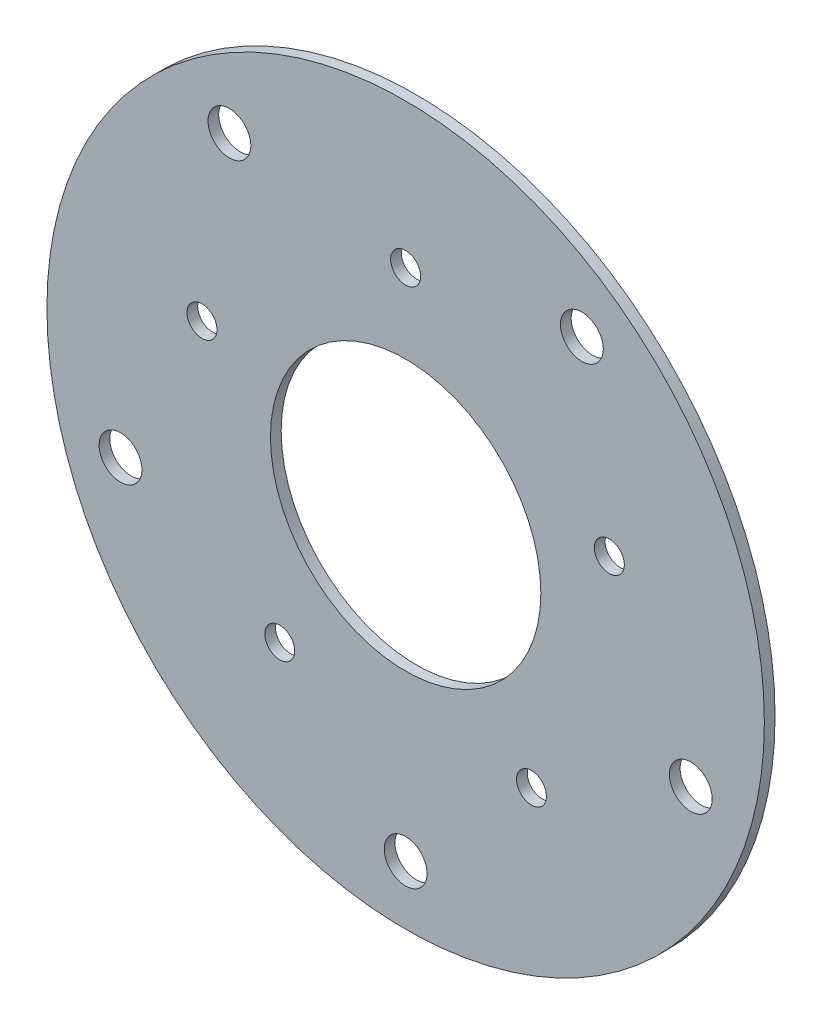
ISO-10303-21;
HEADER;
FILE_DESCRIPTION(('STEP AP214'),'2;1');
FILE_NAME('part.step','',(''),(''),'','','');
FILE_SCHEMA(('AUTOMOTIVE_DESIGN { 1 0 10303 214 1 1 1 1 }'));
ENDSEC;
DATA;
#1=APPLICATION_CONTEXT('core data for automotive mechanical design processes');
#2=APPLICATION_PROTOCOL_DEFINITION('international standard','automotive_design',2000,#1);
#3=PRODUCT_CONTEXT('',#1,'mechanical');
#4=PRODUCT('Part','Part','',(#3));
#5=PRODUCT_RELATED_PRODUCT_CATEGORY('part','',(#4));
#6=PRODUCT_DEFINITION_FORMATION('','',#4);
#7=PRODUCT_DEFINITION_CONTEXT('part definition',#1,'design');
#8=PRODUCT_DEFINITION('design','',#6,#7);
#9=PRODUCT_DEFINITION_SHAPE('','',#8);
#10=(LENGTH_UNIT() NAMED_UNIT(*) SI_UNIT(.MILLI.,.METRE.));
#11=(NAMED_UNIT(*) PLANE_ANGLE_UNIT() SI_UNIT($,.RADIAN.));
#12=(NAMED_UNIT(*) SI_UNIT($,.STERADIAN.) SOLID_ANGLE_UNIT());
#13=UNCERTAINTY_MEASURE_WITH_UNIT(LENGTH_MEASURE(1.E-05),#10,'distance_accuracy_value','');
#14=(GEOMETRIC_REPRESENTATION_CONTEXT(3) GLOBAL_UNCERTAINTY_ASSIGNED_CONTEXT((#13)) GLOBAL_UNIT_ASSIGNED_CONTEXT((#10,
#11,#12)) REPRESENTATION_CONTEXT('',''));
#15=CARTESIAN_POINT('',(0.,0.,0.));
#16=DIRECTION('',(0.,0.,1.));
#17=DIRECTION('',(1.,0.,0.));
#18=AXIS2_PLACEMENT_3D('',#15,#16,#17);
#19=CARTESIAN_POINT('',(0.,0.,1.));
#20=DIRECTION('',(0.,0.,1.));
#21=DIRECTION('',(1.,0.,0.));
#22=AXIS2_PLACEMENT_3D('',#19,#20,#21);
#23=PLANE('',#22);
#24=CARTESIAN_POINT('',(19.0211303259031,6.18033988749875,1.));
#25=DIRECTION('',(0.,0.,1.));
#26=DIRECTION('',(1.,0.,0.));
#27=AXIS2_PLACEMENT_3D('',#24,#25,#26);
#28=CIRCLE('',#27,1.4);
#29=CARTESIAN_POINT('',(20.4211303259031,6.18033988749875,1.));
#30=VERTEX_POINT('',#29);
#31=EDGE_CURVE('E96',#30,#30,#28,.T.);
#32=ORIENTED_EDGE('',*,*,#31,.F.);
#33=EDGE_LOOP('',(#32));
#34=FACE_BOUND('',#33,.T.);
#35=CARTESIAN_POINT('',(-19.021130325903,6.18033988749904,1.));
#36=DIRECTION('',(0.,0.,1.));
#37=DIRECTION('',(1.,0.,0.));
#38=AXIS2_PLACEMENT_3D('',#35,#36,#37);
#39=CIRCLE('',#38,1.4);
#40=CARTESIAN_POINT('',(-17.621130325903,6.18033988749904,1.));
#41=VERTEX_POINT('',#40);
#42=EDGE_CURVE('E84',#41,#41,#39,.T.);
#43=ORIENTED_EDGE('',*,*,#42,.F.);
#44=EDGE_LOOP('',(#43));
#45=FACE_BOUND('',#44,.T.);
#46=CARTESIAN_POINT('',(26.6295824562642,-8.65247584249883,1.));
#47=DIRECTION('',(0.,0.,1.));
#48=DIRECTION('',(1.,0.,0.));
#49=AXIS2_PLACEMENT_3D('',#46,#47,#48);
#50=CIRCLE('',#49,2.);
#51=CARTESIAN_POINT('',(28.6295824562642,-8.65247584249883,1.));
#52=VERTEX_POINT('',#51);
#53=EDGE_CURVE('E72',#52,#52,#50,.T.);
#54=ORIENTED_EDGE('',*,*,#53,.F.);
#55=EDGE_LOOP('',(#54));
#56=FACE_BOUND('',#55,.T.);
#57=CARTESIAN_POINT('',(-16.4579870641891,22.6524758424986,1.));
#58=DIRECTION('',(0.,0.,1.));
#59=DIRECTION('',(1.,0.,0.));
#60=AXIS2_PLACEMENT_3D('',#57,#58,#59);
#61=CIRCLE('',#60,2.);
#62=CARTESIAN_POINT('',(-14.4579870641891,22.6524758424986,1.));
#63=VERTEX_POINT('',#62);
#64=EDGE_CURVE('E60',#63,#63,#61,.T.);
#65=ORIENTED_EDGE('',*,*,#64,.F.);
#66=EDGE_LOOP('',(#65));
#67=FACE_BOUND('',#66,.T.);
#68=CARTESIAN_POINT('',(0.,-28.,1.));
#69=DIRECTION('',(0.,0.,1.));
#70=DIRECTION('',(1.,0.,0.));
#71=AXIS2_PLACEMENT_3D('',#68,#69,#70);
#72=CIRCLE('',#71,2.);
#73=CARTESIAN_POINT('',(2.,-28.,1.));
#74=VERTEX_POINT('',#73);
#75=EDGE_CURVE('E48',#74,#74,#72,.T.);
#76=ORIENTED_EDGE('',*,*,#75,.F.);
#77=EDGE_LOOP('',(#76));
#78=FACE_BOUND('',#77,.T.);
#79=CARTESIAN_POINT('',(0.,0.,1.));
#80=DIRECTION('',(0.,0.,1.));
#81=DIRECTION('',(1.,0.,0.));
#82=AXIS2_PLACEMENT_3D('',#79,#80,#81);
#83=CIRCLE('',#82,33.5);
#84=CARTESIAN_POINT('',(33.5,0.,1.));
#85=VERTEX_POINT('',#84);
#86=EDGE_CURVE('E10',#85,#85,#83,.T.);
#87=ORIENTED_EDGE('',*,*,#86,.T.);
#88=EDGE_LOOP('',(#87));
#89=FACE_BOUND('',#88,.T.);
#90=CARTESIAN_POINT('',(0.,0.,1.));
#91=DIRECTION('',(0.,0.,1.));
#92=DIRECTION('',(1.,0.,0.));
#93=AXIS2_PLACEMENT_3D('',#90,#91,#92);
#94=CIRCLE('',#93,12.625);
#95=CARTESIAN_POINT('',(12.625,0.,1.));
#96=VERTEX_POINT('',#95);
#97=EDGE_CURVE('E43',#96,#96,#94,.T.);
#98=ORIENTED_EDGE('',*,*,#97,.F.);
#99=EDGE_LOOP('',(#98));
#100=FACE_BOUND('',#99,.T.);
#101=CARTESIAN_POINT('',(-26.6295824562643,-8.65247584249846,1.));
#102=DIRECTION('',(0.,0.,1.));
#103=DIRECTION('',(1.,0.,0.));
#104=AXIS2_PLACEMENT_3D('',#101,#102,#103);
#105=CIRCLE('',#104,2.);
#106=CARTESIAN_POINT('',(-24.6295824562643,-8.65247584249846,1.));
#107=VERTEX_POINT('',#106);
#108=EDGE_CURVE('E54',#107,#107,#105,.T.);
#109=ORIENTED_EDGE('',*,*,#108,.F.);
#110=EDGE_LOOP('',(#109));
#111=FACE_BOUND('',#110,.T.);
#112=CARTESIAN_POINT('',(16.4579870641894,22.6524758424984,1.));
#113=DIRECTION('',(0.,0.,1.));
#114=DIRECTION('',(1.,0.,0.));
#115=AXIS2_PLACEMENT_3D('',#112,#113,#114);
#116=CIRCLE('',#115,2.);
#117=CARTESIAN_POINT('',(18.4579870641894,22.6524758424984,1.));
#118=VERTEX_POINT('',#117);
#119=EDGE_CURVE('E66',#118,#118,#116,.T.);
#120=ORIENTED_EDGE('',*,*,#119,.F.);
#121=EDGE_LOOP('',(#120));
#122=FACE_BOUND('',#121,.T.);
#123=CARTESIAN_POINT('',(-11.7557050458495,-16.1803398874989,1.));
#124=DIRECTION('',(0.,0.,1.));
#125=DIRECTION('',(1.,0.,0.));
#126=AXIS2_PLACEMENT_3D('',#123,#124,#125);
#127=CIRCLE('',#126,1.4);
#128=CARTESIAN_POINT('',(-10.3557050458495,-16.1803398874989,1.));
#129=VERTEX_POINT('',#128);
#130=EDGE_CURVE('E78',#129,#129,#127,.T.);
#131=ORIENTED_EDGE('',*,*,#130,.F.);
#132=EDGE_LOOP('',(#131));
#133=FACE_BOUND('',#132,.T.);
#134=CARTESIAN_POINT('',(1.50920942409982E-13,20.,1.));
#135=DIRECTION('',(0.,0.,1.));
#136=DIRECTION('',(1.,0.,0.));
#137=AXIS2_PLACEMENT_3D('',#134,#135,#136);
#138=CIRCLE('',#137,1.4);
#139=CARTESIAN_POINT('',(1.40000000000015,20.,1.));
#140=VERTEX_POINT('',#139);
#141=EDGE_CURVE('E90',#140,#140,#138,.T.);
#142=ORIENTED_EDGE('',*,*,#141,.F.);
#143=EDGE_LOOP('',(#142));
#144=FACE_BOUND('',#143,.T.);
#145=CARTESIAN_POINT('',(11.7557050458493,-16.1803398874991,1.));
#146=DIRECTION('',(0.,0.,1.));
#147=DIRECTION('',(1.,0.,0.));
#148=AXIS2_PLACEMENT_3D('',#145,#146,#147);
#149=CIRCLE('',#148,1.4);
#150=CARTESIAN_POINT('',(13.1557050458493,-16.1803398874991,1.));
#151=VERTEX_POINT('',#150);
#152=EDGE_CURVE('E102',#151,#151,#149,.T.);
#153=ORIENTED_EDGE('',*,*,#152,.F.);
#154=EDGE_LOOP('',(#153));
#155=FACE_BOUND('',#154,.T.);
#156=ADVANCED_FACE('F32',(#34,#45,#56,#67,#78,#89,#100,#111,#122,#133,#144,#155),#23,.T.);
#157=CARTESIAN_POINT('',(0.,0.,0.));
#158=DIRECTION('',(0.,0.,1.));
#159=DIRECTION('',(1.,0.,0.));
#160=AXIS2_PLACEMENT_3D('',#157,#158,#159);
#161=PLANE('',#160);
#162=CARTESIAN_POINT('',(0.,0.,0.));
#163=DIRECTION('',(0.,0.,1.));
#164=DIRECTION('',(1.,0.,0.));
#165=AXIS2_PLACEMENT_3D('',#162,#163,#164);
#166=CIRCLE('',#165,33.5);
#167=CARTESIAN_POINT('',(33.5,0.,0.));
#168=VERTEX_POINT('',#167);
#169=EDGE_CURVE('E36',#168,#168,#166,.T.);
#170=ORIENTED_EDGE('',*,*,#169,.F.);
#171=EDGE_LOOP('',(#170));
#172=FACE_BOUND('',#171,.T.);
#173=CARTESIAN_POINT('',(0.,0.,0.));
#174=DIRECTION('',(0.,0.,1.));
#175=DIRECTION('',(1.,0.,0.));
#176=AXIS2_PLACEMENT_3D('',#173,#174,#175);
#177=CIRCLE('',#176,12.625);
#178=CARTESIAN_POINT('',(12.625,0.,0.));
#179=VERTEX_POINT('',#178);
#180=EDGE_CURVE('E45',#179,#179,#177,.T.);
#181=ORIENTED_EDGE('',*,*,#180,.T.);
#182=EDGE_LOOP('',(#181));
#183=FACE_BOUND('',#182,.T.);
#184=CARTESIAN_POINT('',(0.,-28.,0.));
#185=DIRECTION('',(0.,0.,1.));
#186=DIRECTION('',(1.,0.,0.));
#187=AXIS2_PLACEMENT_3D('',#184,#185,#186);
#188=CIRCLE('',#187,2.);
#189=CARTESIAN_POINT('',(2.,-28.,0.));
#190=VERTEX_POINT('',#189);
#191=EDGE_CURVE('E51',#190,#190,#188,.T.);
#192=ORIENTED_EDGE('',*,*,#191,.T.);
#193=EDGE_LOOP('',(#192));
#194=FACE_BOUND('',#193,.T.);
#195=CARTESIAN_POINT('',(-26.6295824562643,-8.65247584249846,0.));
#196=DIRECTION('',(0.,0.,1.));
#197=DIRECTION('',(1.,0.,0.));
#198=AXIS2_PLACEMENT_3D('',#195,#196,#197);
#199=CIRCLE('',#198,2.);
#200=CARTESIAN_POINT('',(-24.6295824562643,-8.65247584249846,0.));
#201=VERTEX_POINT('',#200);
#202=EDGE_CURVE('E57',#201,#201,#199,.T.);
#203=ORIENTED_EDGE('',*,*,#202,.T.);
#204=EDGE_LOOP('',(#203));
#205=FACE_BOUND('',#204,.T.);
#206=CARTESIAN_POINT('',(-16.4579870641891,22.6524758424986,0.));
#207=DIRECTION('',(0.,0.,1.));
#208=DIRECTION('',(1.,0.,0.));
#209=AXIS2_PLACEMENT_3D('',#206,#207,#208);
#210=CIRCLE('',#209,2.);
#211=CARTESIAN_POINT('',(-14.4579870641891,22.6524758424986,0.));
#212=VERTEX_POINT('',#211);
#213=EDGE_CURVE('E63',#212,#212,#210,.T.);
#214=ORIENTED_EDGE('',*,*,#213,.T.);
#215=EDGE_LOOP('',(#214));
#216=FACE_BOUND('',#215,.T.);
#217=CARTESIAN_POINT('',(16.4579870641894,22.6524758424984,0.));
#218=DIRECTION('',(0.,0.,1.));
#219=DIRECTION('',(1.,0.,0.));
#220=AXIS2_PLACEMENT_3D('',#217,#218,#219);
#221=CIRCLE('',#220,2.);
#222=CARTESIAN_POINT('',(18.4579870641894,22.6524758424984,0.));
#223=VERTEX_POINT('',#222);
#224=EDGE_CURVE('E69',#223,#223,#221,.T.);
#225=ORIENTED_EDGE('',*,*,#224,.T.);
#226=EDGE_LOOP('',(#225));
#227=FACE_BOUND('',#226,.T.);
#228=CARTESIAN_POINT('',(26.6295824562642,-8.65247584249883,0.));
#229=DIRECTION('',(0.,0.,1.));
#230=DIRECTION('',(1.,0.,0.));
#231=AXIS2_PLACEMENT_3D('',#228,#229,#230);
#232=CIRCLE('',#231,2.);
#233=CARTESIAN_POINT('',(28.6295824562642,-8.65247584249883,0.));
#234=VERTEX_POINT('',#233);
#235=EDGE_CURVE('E75',#234,#234,#232,.T.);
#236=ORIENTED_EDGE('',*,*,#235,.T.);
#237=EDGE_LOOP('',(#236));
#238=FACE_BOUND('',#237,.T.);
#239=CARTESIAN_POINT('',(-11.7557050458495,-16.1803398874989,0.));
#240=DIRECTION('',(0.,0.,1.));
#241=DIRECTION('',(1.,0.,0.));
#242=AXIS2_PLACEMENT_3D('',#239,#240,#241);
#243=CIRCLE('',#242,1.4);
#244=CARTESIAN_POINT('',(-10.3557050458495,-16.1803398874989,0.));
#245=VERTEX_POINT('',#244);
#246=EDGE_CURVE('E81',#245,#245,#243,.T.);
#247=ORIENTED_EDGE('',*,*,#246,.T.);
#248=EDGE_LOOP('',(#247));
#249=FACE_BOUND('',#248,.T.);
#250=CARTESIAN_POINT('',(-19.021130325903,6.18033988749904,0.));
#251=DIRECTION('',(0.,0.,1.));
#252=DIRECTION('',(1.,0.,0.));
#253=AXIS2_PLACEMENT_3D('',#250,#251,#252);
#254=CIRCLE('',#253,1.4);
#255=CARTESIAN_POINT('',(-17.621130325903,6.18033988749904,0.));
#256=VERTEX_POINT('',#255);
#257=EDGE_CURVE('E87',#256,#256,#254,.T.);
#258=ORIENTED_EDGE('',*,*,#257,.T.);
#259=EDGE_LOOP('',(#258));
#260=FACE_BOUND('',#259,.T.);
#261=CARTESIAN_POINT('',(1.50920942409982E-13,20.,0.));
#262=DIRECTION('',(0.,0.,1.));
#263=DIRECTION('',(1.,0.,0.));
#264=AXIS2_PLACEMENT_3D('',#261,#262,#263);
#265=CIRCLE('',#264,1.4);
#266=CARTESIAN_POINT('',(1.40000000000015,20.,0.));
#267=VERTEX_POINT('',#266);
#268=EDGE_CURVE('E93',#267,#267,#265,.T.);
#269=ORIENTED_EDGE('',*,*,#268,.T.);
#270=EDGE_LOOP('',(#269));
#271=FACE_BOUND('',#270,.T.);
#272=CARTESIAN_POINT('',(19.0211303259031,6.18033988749875,0.));
#273=DIRECTION('',(0.,0.,1.));
#274=DIRECTION('',(1.,0.,0.));
#275=AXIS2_PLACEMENT_3D('',#272,#273,#274);
#276=CIRCLE('',#275,1.4);
#277=CARTESIAN_POINT('',(20.4211303259031,6.18033988749875,0.));
#278=VERTEX_POINT('',#277);
#279=EDGE_CURVE('E99',#278,#278,#276,.T.);
#280=ORIENTED_EDGE('',*,*,#279,.T.);
#281=EDGE_LOOP('',(#280));
#282=FACE_BOUND('',#281,.T.);
#283=CARTESIAN_POINT('',(11.7557050458493,-16.1803398874991,0.));
#284=DIRECTION('',(0.,0.,1.));
#285=DIRECTION('',(1.,0.,0.));
#286=AXIS2_PLACEMENT_3D('',#283,#284,#285);
#287=CIRCLE('',#286,1.4);
#288=CARTESIAN_POINT('',(13.1557050458493,-16.1803398874991,0.));
#289=VERTEX_POINT('',#288);
#290=EDGE_CURVE('E105',#289,#289,#287,.T.);
#291=ORIENTED_EDGE('',*,*,#290,.T.);
#292=EDGE_LOOP('',(#291));
#293=FACE_BOUND('',#292,.T.);
#294=ADVANCED_FACE('F115',(#172,#183,#194,#205,#216,#227,#238,#249,#260,#271,#282,#293),#161,.F.);
#295=CARTESIAN_POINT('',(0.,0.,1.));
#296=DIRECTION('',(0.,0.,-1.));
#297=DIRECTION('',(-1.,0.,0.));
#298=AXIS2_PLACEMENT_3D('',#295,#296,#297);
#299=CYLINDRICAL_SURFACE('',#298,33.5);
#300=ORIENTED_EDGE('',*,*,#86,.F.);
#301=EDGE_LOOP('',(#300));
#302=FACE_BOUND('',#301,.T.);
#303=ORIENTED_EDGE('',*,*,#169,.T.);
#304=EDGE_LOOP('',(#303));
#305=FACE_BOUND('',#304,.T.);
#306=ADVANCED_FACE('F34',(#302,#305),#299,.T.);
#307=CARTESIAN_POINT('',(0.,0.,1.));
#308=DIRECTION('',(0.,0.,-1.));
#309=DIRECTION('',(-1.,0.,0.));
#310=AXIS2_PLACEMENT_3D('',#307,#308,#309);
#311=CYLINDRICAL_SURFACE('',#310,12.625);
#312=ORIENTED_EDGE('',*,*,#97,.T.);
#313=EDGE_LOOP('',(#312));
#314=FACE_BOUND('',#313,.T.);
#315=ORIENTED_EDGE('',*,*,#180,.F.);
#316=EDGE_LOOP('',(#315));
#317=FACE_BOUND('',#316,.T.);
#318=ADVANCED_FACE('F125',(#314,#317),#311,.F.);
#319=CARTESIAN_POINT('',(0.,-28.,1.));
#320=DIRECTION('',(0.,0.,-1.));
#321=DIRECTION('',(-1.,0.,0.));
#322=AXIS2_PLACEMENT_3D('',#319,#320,#321);
#323=CYLINDRICAL_SURFACE('',#322,2.);
#324=ORIENTED_EDGE('',*,*,#75,.T.);
#325=EDGE_LOOP('',(#324));
#326=FACE_BOUND('',#325,.T.);
#327=ORIENTED_EDGE('',*,*,#191,.F.);
#328=EDGE_LOOP('',(#327));
#329=FACE_BOUND('',#328,.T.);
#330=ADVANCED_FACE('F128',(#326,#329),#323,.F.);
#331=CARTESIAN_POINT('',(-26.6295824562643,-8.65247584249846,1.));
#332=DIRECTION('',(0.,0.,-1.));
#333=DIRECTION('',(-1.,0.,0.));
#334=AXIS2_PLACEMENT_3D('',#331,#332,#333);
#335=CYLINDRICAL_SURFACE('',#334,2.);
#336=ORIENTED_EDGE('',*,*,#108,.T.);
#337=EDGE_LOOP('',(#336));
#338=FACE_BOUND('',#337,.T.);
#339=ORIENTED_EDGE('',*,*,#202,.F.);
#340=EDGE_LOOP('',(#339));
#341=FACE_BOUND('',#340,.T.);
#342=ADVANCED_FACE('F132',(#338,#341),#335,.F.);
#343=CARTESIAN_POINT('',(-16.4579870641891,22.6524758424986,1.));
#344=DIRECTION('',(0.,0.,-1.));
#345=DIRECTION('',(-1.,0.,0.));
#346=AXIS2_PLACEMENT_3D('',#343,#344,#345);
#347=CYLINDRICAL_SURFACE('',#346,2.);
#348=ORIENTED_EDGE('',*,*,#64,.T.);
#349=EDGE_LOOP('',(#348));
#350=FACE_BOUND('',#349,.T.);
#351=ORIENTED_EDGE('',*,*,#213,.F.);
#352=EDGE_LOOP('',(#351));
#353=FACE_BOUND('',#352,.T.);
#354=ADVANCED_FACE('F136',(#350,#353),#347,.F.);
#355=CARTESIAN_POINT('',(16.4579870641894,22.6524758424984,1.));
#356=DIRECTION('',(0.,0.,-1.));
#357=DIRECTION('',(-1.,0.,0.));
#358=AXIS2_PLACEMENT_3D('',#355,#356,#357);
#359=CYLINDRICAL_SURFACE('',#358,2.);
#360=ORIENTED_EDGE('',*,*,#119,.T.);
#361=EDGE_LOOP('',(#360));
#362=FACE_BOUND('',#361,.T.);
#363=ORIENTED_EDGE('',*,*,#224,.F.);
#364=EDGE_LOOP('',(#363));
#365=FACE_BOUND('',#364,.T.);
#366=ADVANCED_FACE('F140',(#362,#365),#359,.F.);
#367=CARTESIAN_POINT('',(26.6295824562642,-8.65247584249883,1.));
#368=DIRECTION('',(0.,0.,-1.));
#369=DIRECTION('',(-1.,0.,0.));
#370=AXIS2_PLACEMENT_3D('',#367,#368,#369);
#371=CYLINDRICAL_SURFACE('',#370,2.);
#372=ORIENTED_EDGE('',*,*,#53,.T.);
#373=EDGE_LOOP('',(#372));
#374=FACE_BOUND('',#373,.T.);
#375=ORIENTED_EDGE('',*,*,#235,.F.);
#376=EDGE_LOOP('',(#375));
#377=FACE_BOUND('',#376,.T.);
#378=ADVANCED_FACE('F144',(#374,#377),#371,.F.);
#379=CARTESIAN_POINT('',(-11.7557050458495,-16.1803398874989,1.));
#380=DIRECTION('',(0.,0.,-1.));
#381=DIRECTION('',(-1.,0.,0.));
#382=AXIS2_PLACEMENT_3D('',#379,#380,#381);
#383=CYLINDRICAL_SURFACE('',#382,1.4);
#384=ORIENTED_EDGE('',*,*,#130,.T.);
#385=EDGE_LOOP('',(#384));
#386=FACE_BOUND('',#385,.T.);
#387=ORIENTED_EDGE('',*,*,#246,.F.);
#388=EDGE_LOOP('',(#387));
#389=FACE_BOUND('',#388,.T.);
#390=ADVANCED_FACE('F148',(#386,#389),#383,.F.);
#391=CARTESIAN_POINT('',(-19.021130325903,6.18033988749904,1.));
#392=DIRECTION('',(0.,0.,-1.));
#393=DIRECTION('',(-1.,0.,0.));
#394=AXIS2_PLACEMENT_3D('',#391,#392,#393);
#395=CYLINDRICAL_SURFACE('',#394,1.4);
#396=ORIENTED_EDGE('',*,*,#42,.T.);
#397=EDGE_LOOP('',(#396));
#398=FACE_BOUND('',#397,.T.);
#399=ORIENTED_EDGE('',*,*,#257,.F.);
#400=EDGE_LOOP('',(#399));
#401=FACE_BOUND('',#400,.T.);
#402=ADVANCED_FACE('F152',(#398,#401),#395,.F.);
#403=CARTESIAN_POINT('',(1.50920942409982E-13,20.,1.));
#404=DIRECTION('',(0.,0.,-1.));
#405=DIRECTION('',(-1.,0.,0.));
#406=AXIS2_PLACEMENT_3D('',#403,#404,#405);
#407=CYLINDRICAL_SURFACE('',#406,1.4);
#408=ORIENTED_EDGE('',*,*,#141,.T.);
#409=EDGE_LOOP('',(#408));
#410=FACE_BOUND('',#409,.T.);
#411=ORIENTED_EDGE('',*,*,#268,.F.);
#412=EDGE_LOOP('',(#411));
#413=FACE_BOUND('',#412,.T.);
#414=ADVANCED_FACE('F156',(#410,#413),#407,.F.);
#415=CARTESIAN_POINT('',(19.0211303259031,6.18033988749875,1.));
#416=DIRECTION('',(0.,0.,-1.));
#417=DIRECTION('',(-1.,0.,0.));
#418=AXIS2_PLACEMENT_3D('',#415,#416,#417);
#419=CYLINDRICAL_SURFACE('',#418,1.4);
#420=ORIENTED_EDGE('',*,*,#31,.T.);
#421=EDGE_LOOP('',(#420));
#422=FACE_BOUND('',#421,.T.);
#423=ORIENTED_EDGE('',*,*,#279,.F.);
#424=EDGE_LOOP('',(#423));
#425=FACE_BOUND('',#424,.T.);
#426=ADVANCED_FACE('F160',(#422,#425),#419,.F.);
#427=CARTESIAN_POINT('',(11.7557050458493,-16.1803398874991,1.));
#428=DIRECTION('',(0.,0.,-1.));
#429=DIRECTION('',(-1.,0.,0.));
#430=AXIS2_PLACEMENT_3D('',#427,#428,#429);
#431=CYLINDRICAL_SURFACE('',#430,1.4);
#432=ORIENTED_EDGE('',*,*,#152,.T.);
#433=EDGE_LOOP('',(#432));
#434=FACE_BOUND('',#433,.T.);
#435=ORIENTED_EDGE('',*,*,#290,.F.);
#436=EDGE_LOOP('',(#435));
#437=FACE_BOUND('',#436,.T.);
#438=ADVANCED_FACE('F111',(#434,#437),#431,.F.);
#439=CLOSED_SHELL('',(#156,#294,#306,#318,#330,#342,#354,#366,#378,#390,#402,#414,#426,#438));
#440=MANIFOLD_SOLID_BREP('B2',#439);
#441=ADVANCED_BREP_SHAPE_REPRESENTATION('',(#18,#440),#14);
#442=SHAPE_DEFINITION_REPRESENTATION(#9,#441);
ENDSEC;
END-ISO-10303-21;
